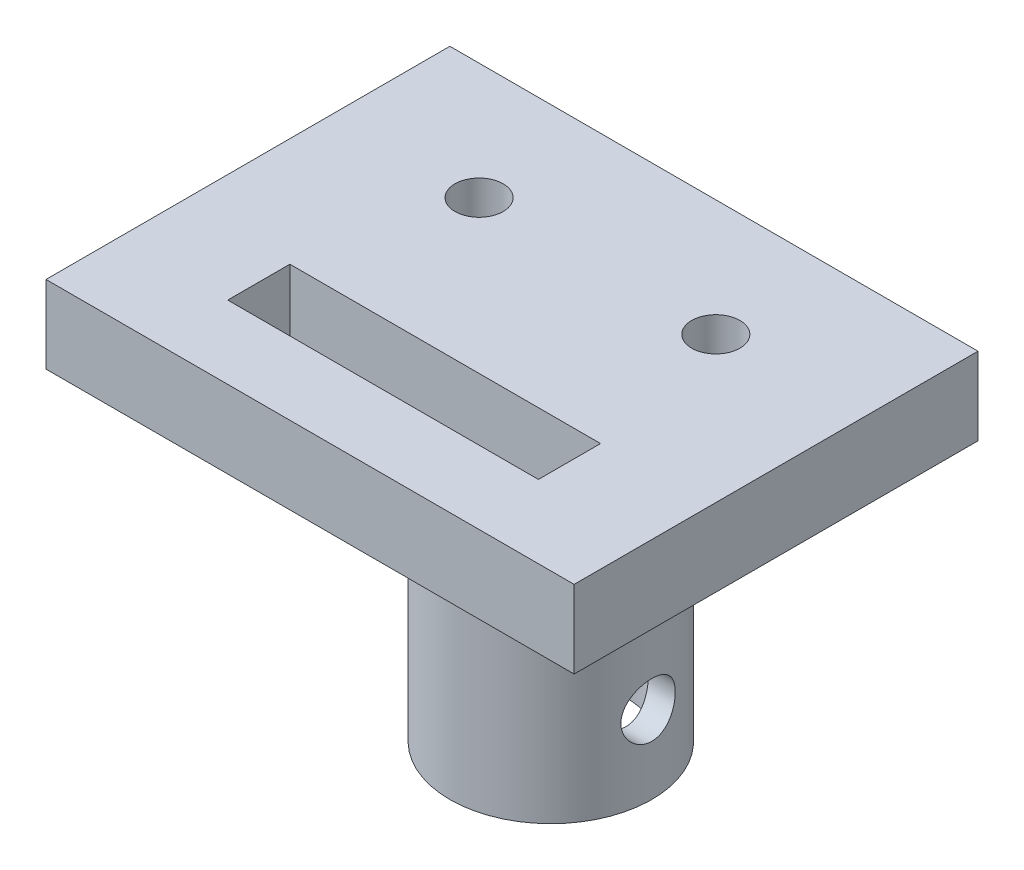
ISO-10303-21;
HEADER;
FILE_DESCRIPTION(('STEP AP214'),'2;1');
FILE_NAME('part.step','',(''),(''),'','','');
FILE_SCHEMA(('AUTOMOTIVE_DESIGN { 1 0 10303 214 1 1 1 1 }'));
ENDSEC;
DATA;
#1=APPLICATION_CONTEXT('core data for automotive mechanical design processes');
#2=APPLICATION_PROTOCOL_DEFINITION('international standard','automotive_design',2000,#1);
#3=PRODUCT_CONTEXT('',#1,'mechanical');
#4=PRODUCT('Part','Part','',(#3));
#5=PRODUCT_RELATED_PRODUCT_CATEGORY('part','',(#4));
#6=PRODUCT_DEFINITION_FORMATION('','',#4);
#7=PRODUCT_DEFINITION_CONTEXT('part definition',#1,'design');
#8=PRODUCT_DEFINITION('design','',#6,#7);
#9=PRODUCT_DEFINITION_SHAPE('','',#8);
#10=(LENGTH_UNIT() NAMED_UNIT(*) SI_UNIT(.MILLI.,.METRE.));
#11=(NAMED_UNIT(*) PLANE_ANGLE_UNIT() SI_UNIT($,.RADIAN.));
#12=(NAMED_UNIT(*) SI_UNIT($,.STERADIAN.) SOLID_ANGLE_UNIT());
#13=UNCERTAINTY_MEASURE_WITH_UNIT(LENGTH_MEASURE(1.E-05),#10,'distance_accuracy_value','');
#14=(GEOMETRIC_REPRESENTATION_CONTEXT(3) GLOBAL_UNCERTAINTY_ASSIGNED_CONTEXT((#13)) GLOBAL_UNIT_ASSIGNED_CONTEXT((#10,
#11,#12)) REPRESENTATION_CONTEXT('',''));
#15=CARTESIAN_POINT('',(0.,0.,0.));
#16=DIRECTION('',(0.,0.,1.));
#17=DIRECTION('',(1.,0.,0.));
#18=AXIS2_PLACEMENT_3D('',#15,#16,#17);
#19=CARTESIAN_POINT('',(0.,25.,0.));
#20=DIRECTION('',(0.,-1.,0.));
#21=DIRECTION('',(0.,0.,-1.));
#22=AXIS2_PLACEMENT_3D('',#19,#20,#21);
#23=CYLINDRICAL_SURFACE('',#22,6.5);
#24=CARTESIAN_POINT('',(-6.25999201277446,5.,-1.75));
#25=CARTESIAN_POINT('',(-6.25999364834224,5.09636693152251,-1.74999774759581));
#26=CARTESIAN_POINT('',(-6.26224156413629,5.19275754831568,-1.74201295319679));
#27=CARTESIAN_POINT('',(-6.27096280675779,5.38275250326044,-1.71034684680834));
#28=CARTESIAN_POINT('',(-6.27743820017108,5.47635545526069,-1.68665785779757));
#29=CARTESIAN_POINT('',(-6.2938290415138,5.65799901010124,-1.62442051083002));
#30=CARTESIAN_POINT('',(-6.30373958680569,5.7460473299389,-1.58589332124237));
#31=CARTESIAN_POINT('',(-6.32587778448479,5.91444505060657,-1.4951397936086));
#32=CARTESIAN_POINT('',(-6.3381056295633,5.99479381035502,-1.44291231619848));
#33=CARTESIAN_POINT('',(-6.36384999967837,6.14756006850606,-1.32481683575955));
#34=CARTESIAN_POINT('',(-6.3773897230645,6.21975220686104,-1.25866230723127));
#35=CARTESIAN_POINT('',(-6.40403218819677,6.35216265841744,-1.11520667104591));
#36=CARTESIAN_POINT('',(-6.41713488377715,6.41237970993447,-1.03790439035032));
#37=CARTESIAN_POINT('',(-6.44168618098059,6.5200732158384,-0.872781950497455));
#38=CARTESIAN_POINT('',(-6.45310422745752,6.56732520712722,-0.784810457726846));
#39=CARTESIAN_POINT('',(-6.47273330056194,6.64628270229484,-0.601812853080337));
#40=CARTESIAN_POINT('',(-6.48094487877107,6.67799088028443,-0.506787957891642));
#41=CARTESIAN_POINT('',(-6.49307175079196,6.72423010837478,-0.314733668615914));
#42=CARTESIAN_POINT('',(-6.49708279945289,6.73914461038798,-0.217802747330066));
#43=CARTESIAN_POINT('',(-6.50069164682133,6.75257997140598,-0.0227371580313452));
#44=CARTESIAN_POINT('',(-6.50029019790354,6.75110362521287,0.075397301915884));
#45=CARTESIAN_POINT('',(-6.49518926169102,6.73206830522229,0.267413777691123));
#46=CARTESIAN_POINT('',(-6.49060051383683,6.71492368507153,0.361340261807487));
#47=CARTESIAN_POINT('',(-6.47777153275455,6.66570843590665,0.544930372626499));
#48=CARTESIAN_POINT('',(-6.46953108931706,6.63363694762386,0.634593753595074));
#49=CARTESIAN_POINT('',(-6.45016118673602,6.55516353757223,0.808164857586516));
#50=CARTESIAN_POINT('',(-6.4390034608576,6.50862051045036,0.892005501146503));
#51=CARTESIAN_POINT('',(-6.41499985670216,6.40263373543751,1.05082715179685));
#52=CARTESIAN_POINT('',(-6.40215364408583,6.34318743103043,1.12580639863237));
#53=CARTESIAN_POINT('',(-6.3756898932816,6.21088557205601,1.26725020143798));
#54=CARTESIAN_POINT('',(-6.36206079715831,6.13766877046341,1.33337509587472));
#55=CARTESIAN_POINT('',(-6.3359290690376,5.98104466905633,1.45249162046951));
#56=CARTESIAN_POINT('',(-6.32342650852571,5.8976367233418,1.5054824175621));
#57=CARTESIAN_POINT('',(-6.30091637245831,5.72225009692862,1.59709184385151));
#58=CARTESIAN_POINT('',(-6.2909252527284,5.63022004826683,1.63561645775796));
#59=CARTESIAN_POINT('',(-6.27477285061401,5.44065286740862,1.69653467948176));
#60=CARTESIAN_POINT('',(-6.26861059736745,5.3431171381018,1.71893237673103));
#61=CARTESIAN_POINT('',(-6.26102094544429,5.14848803959217,1.74637186636212));
#62=CARTESIAN_POINT('',(-6.25945517547943,5.05147152071337,1.75192104365597));
#63=CARTESIAN_POINT('',(-6.26085688983675,4.85789646580634,1.74690530793352));
#64=CARTESIAN_POINT('',(-6.26382388109206,4.7613378811108,1.73634214759297));
#65=CARTESIAN_POINT('',(-6.27382299499931,4.57338610023024,1.69984924549858));
#66=CARTESIAN_POINT('',(-6.2807739509207,4.48192864140859,1.67422606891518));
#67=CARTESIAN_POINT('',(-6.2978781488742,4.30460992983483,1.60868595575755));
#68=CARTESIAN_POINT('',(-6.30803181501428,4.21874942005764,1.56876712603544));
#69=CARTESIAN_POINT('',(-6.3306802252249,4.05294338845818,1.4747437932278));
#70=CARTESIAN_POINT('',(-6.34322221754839,3.97317294112376,1.42034219945109));
#71=CARTESIAN_POINT('',(-6.36912368079378,3.82370694371339,1.29926471321738));
#72=CARTESIAN_POINT('',(-6.38248330813777,3.75401333006983,1.23258646717787));
#73=CARTESIAN_POINT('',(-6.40899229302136,3.62456493243245,1.08649869302637));
#74=CARTESIAN_POINT('',(-6.42212379122641,3.56516441907997,1.00677135328087));
#75=CARTESIAN_POINT('',(-6.4462926745243,3.46058906570298,0.83818329845797));
#76=CARTESIAN_POINT('',(-6.45733017110619,3.41541346822946,0.749323070023385));
#77=CARTESIAN_POINT('',(-6.47599626465671,3.34098780866232,0.565617208692505));
#78=CARTESIAN_POINT('',(-6.48365032258865,3.31161842448717,0.470822629812637));
#79=CARTESIAN_POINT('',(-6.49479925674954,3.26929493149581,0.277406294370145));
#80=CARTESIAN_POINT('',(-6.49829507386145,3.25633710920122,0.178785408800943));
#81=CARTESIAN_POINT('',(-6.50068826313714,3.24744093440552,-0.01617708383555));
#82=CARTESIAN_POINT('',(-6.49972592187705,3.25098338109258,-0.112493609735221));
#83=CARTESIAN_POINT('',(-6.49362915521792,3.2737790501558,-0.303106968695978));
#84=CARTESIAN_POINT('',(-6.48849489189772,3.2930316621934,-0.397403880072862));
#85=CARTESIAN_POINT('',(-6.47465995714558,3.34640532578378,-0.580663944124789));
#86=CARTESIAN_POINT('',(-6.46598501203548,3.38041923341873,-0.669660373083969));
#87=CARTESIAN_POINT('',(-6.44597493719409,3.46225440917336,-0.840733705885811));
#88=CARTESIAN_POINT('',(-6.43463942891539,3.51007764231986,-0.922809622810748));
#89=CARTESIAN_POINT('',(-6.41013655471924,3.61968338617937,-1.08012193055954));
#90=CARTESIAN_POINT('',(-6.39692789682886,3.68180882444473,-1.15511293807839));
#91=CARTESIAN_POINT('',(-6.37033174209729,3.81760750704241,-1.29378095877782));
#92=CARTESIAN_POINT('',(-6.35694419882193,3.89128380513143,-1.35745497050412));
#93=CARTESIAN_POINT('',(-6.33115802415569,4.05009028339241,-1.47310400417226));
#94=CARTESIAN_POINT('',(-6.31878848133984,4.13544118706903,-1.52478300921252));
#95=CARTESIAN_POINT('',(-6.2968530124979,4.31394271271354,-1.6129852621157));
#96=CARTESIAN_POINT('',(-6.2872852876391,4.40708828070918,-1.64951824037444));
#97=CARTESIAN_POINT('',(-6.2733380131077,4.58321606222728,-1.70171523556073));
#98=CARTESIAN_POINT('',(-6.26837422512567,4.66544849671204,-1.71977900317143));
#99=CARTESIAN_POINT('',(-6.26170070500979,4.83178142103546,-1.74392165433437));
#100=CARTESIAN_POINT('',(-6.25999058509381,4.91588168705138,-1.75000196611469));
#101=CARTESIAN_POINT('',(-6.25999201277446,5.,-1.75));
#102=B_SPLINE_CURVE_WITH_KNOTS('',3,(#24,#25,#26,#27,#28,#29,#30,#31,#32,#33,#34,#35,#36,#37,
#38,#39,#40,#41,#42,#43,#44,#45,#46,#47,#48,#49,#50,#51,#52,#53,#54,#55,#56,#57,#58,#59,#60,#61,
#62,#63,#64,#65,#66,#67,#68,#69,#70,#71,#72,#73,#74,#75,#76,#77,#78,#79,#80,#81,#82,#83,#84,#85,
#86,#87,#88,#89,#90,#91,#92,#93,#94,#95,#96,#97,#98,#99,#100,#101),.UNSPECIFIED.,.T.,.F.,(4,2,2,
2,2,2,2,2,2,2,2,2,2,2,2,2,2,2,2,2,2,2,2,2,2,2,2,2,2,2,2,2,2,2,2,2,2,2,4),(0.,0.288791410137463,
0.577724100637719,0.866246113798619,1.1547921290732,1.44998553324109,1.74521002226255,
2.04526257489719,2.34526348926331,2.63826599522772,2.93121854212772,3.21664121132964,
3.50208031298715,3.79039483129319,4.07876652535361,4.37615760001787,4.67356753268635,
4.97287817987484,5.27211290170058,5.56224219802969,5.85233993678286,6.13672745448546,
6.4211526470554,6.71193431253595,7.00277178252912,7.30219773917363,7.60160774927308,
7.89872460917345,8.19577422780333,8.48354110991476,8.77129681284008,9.0569979064276,
9.34273967450006,9.63621883592372,9.92977571709858,10.2299488059667,10.5299287520335,
10.7820436801477,11.0341285585496),.UNSPECIFIED.);
#103=CARTESIAN_POINT('',(-6.25999201277446,5.,-1.75));
#104=VERTEX_POINT('',#103);
#105=EDGE_CURVE('E137',#104,#104,#102,.T.);
#106=ORIENTED_EDGE('',*,*,#105,.T.);
#107=EDGE_LOOP('',(#106));
#108=FACE_BOUND('',#107,.T.);
#109=CARTESIAN_POINT('',(6.25999201277446,5.,-1.75));
#110=CARTESIAN_POINT('',(6.25999364834224,4.90363306847749,-1.74999774759582));
#111=CARTESIAN_POINT('',(6.26224156413629,4.80724245168432,-1.74201295319679));
#112=CARTESIAN_POINT('',(6.27096280675779,4.61724749673956,-1.71034684680835));
#113=CARTESIAN_POINT('',(6.27743820017108,4.52364454473932,-1.68665785779758));
#114=CARTESIAN_POINT('',(6.2938290415138,4.34200098989877,-1.62442051083002));
#115=CARTESIAN_POINT('',(6.30373958680569,4.2539526700611,-1.58589332124238));
#116=CARTESIAN_POINT('',(6.32587778448479,4.08555494939343,-1.4951397936086));
#117=CARTESIAN_POINT('',(6.3381056295633,4.00520618964498,-1.44291231619848));
#118=CARTESIAN_POINT('',(6.36384999967837,3.85243993149394,-1.32481683575956));
#119=CARTESIAN_POINT('',(6.3773897230645,3.78024779313896,-1.25866230723127));
#120=CARTESIAN_POINT('',(6.40403218819677,3.64783734158256,-1.11520667104591));
#121=CARTESIAN_POINT('',(6.41713488377715,3.58762029006553,-1.03790439035032));
#122=CARTESIAN_POINT('',(6.44168618098059,3.4799267841616,-0.872781950497458));
#123=CARTESIAN_POINT('',(6.45310422745752,3.43267479287278,-0.78481045772685));
#124=CARTESIAN_POINT('',(6.47273330056194,3.35371729770516,-0.60181285308034));
#125=CARTESIAN_POINT('',(6.48094487877107,3.32200911971557,-0.506787957891645));
#126=CARTESIAN_POINT('',(6.49307175079196,3.27576989162522,-0.314733668615916));
#127=CARTESIAN_POINT('',(6.49708279945289,3.26085538961202,-0.217802747330069));
#128=CARTESIAN_POINT('',(6.50069164682133,3.24742002859402,-0.0227371580313479));
#129=CARTESIAN_POINT('',(6.50029019790354,3.24889637478714,0.0753973019158814));
#130=CARTESIAN_POINT('',(6.49518926169102,3.26793169477771,0.267413777691121));
#131=CARTESIAN_POINT('',(6.49060051383683,3.28507631492847,0.361340261807485));
#132=CARTESIAN_POINT('',(6.47777153275455,3.33429156409335,0.544930372626496));
#133=CARTESIAN_POINT('',(6.46953108931706,3.36636305237614,0.634593753595071));
#134=CARTESIAN_POINT('',(6.45016118673602,3.44483646242777,0.808164857586513));
#135=CARTESIAN_POINT('',(6.4390034608576,3.49137948954965,0.892005501146501));
#136=CARTESIAN_POINT('',(6.41499985670216,3.59736626456249,1.05082715179685));
#137=CARTESIAN_POINT('',(6.40215364408583,3.65681256896957,1.12580639863236));
#138=CARTESIAN_POINT('',(6.3756898932816,3.78911442794399,1.26725020143797));
#139=CARTESIAN_POINT('',(6.36206079715831,3.86233122953659,1.33337509587472));
#140=CARTESIAN_POINT('',(6.3359290690376,4.01895533094367,1.4524916204695));
#141=CARTESIAN_POINT('',(6.32342650852571,4.1023632766582,1.5054824175621));
#142=CARTESIAN_POINT('',(6.30091637245831,4.27774990307138,1.59709184385151));
#143=CARTESIAN_POINT('',(6.2909252527284,4.36977995173317,1.63561645775796));
#144=CARTESIAN_POINT('',(6.27477285061402,4.55934713259138,1.69653467948176));
#145=CARTESIAN_POINT('',(6.26861059736745,4.65688286189821,1.71893237673102));
#146=CARTESIAN_POINT('',(6.26102094544429,4.85151196040783,1.74637186636212));
#147=CARTESIAN_POINT('',(6.25945517547943,4.94852847928663,1.75192104365597));
#148=CARTESIAN_POINT('',(6.26085688983675,5.14210353419366,1.74690530793352));
#149=CARTESIAN_POINT('',(6.26382388109206,5.2386621188892,1.73634214759296));
#150=CARTESIAN_POINT('',(6.27382299499932,5.42661389976976,1.69984924549857));
#151=CARTESIAN_POINT('',(6.2807739509207,5.51807135859141,1.67422606891518));
#152=CARTESIAN_POINT('',(6.2978781488742,5.69539007016517,1.60868595575755));
#153=CARTESIAN_POINT('',(6.30803181501428,5.78125057994236,1.56876712603544));
#154=CARTESIAN_POINT('',(6.3306802252249,5.94705661154182,1.47474379322779));
#155=CARTESIAN_POINT('',(6.3432222175484,6.02682705887624,1.42034219945109));
#156=CARTESIAN_POINT('',(6.36912368079379,6.17629305628661,1.29926471321737));
#157=CARTESIAN_POINT('',(6.38248330813777,6.24598666993017,1.23258646717786));
#158=CARTESIAN_POINT('',(6.40899229302136,6.37543506756755,1.08649869302637));
#159=CARTESIAN_POINT('',(6.42212379122641,6.43483558092003,1.00677135328087));
#160=CARTESIAN_POINT('',(6.4462926745243,6.53941093429702,0.838183298457966));
#161=CARTESIAN_POINT('',(6.45733017110619,6.58458653177054,0.749323070023381));
#162=CARTESIAN_POINT('',(6.47599626465671,6.65901219133768,0.565617208692501));
#163=CARTESIAN_POINT('',(6.48365032258865,6.68838157551284,0.470822629812632));
#164=CARTESIAN_POINT('',(6.49479925674954,6.73070506850419,0.277406294370141));
#165=CARTESIAN_POINT('',(6.49829507386145,6.74366289079878,0.178785408800939));
#166=CARTESIAN_POINT('',(6.50068826313714,6.75255906559448,-0.0161770838355532));
#167=CARTESIAN_POINT('',(6.49972592187705,6.74901661890742,-0.112493609735223));
#168=CARTESIAN_POINT('',(6.49362915521792,6.7262209498442,-0.30310696869598));
#169=CARTESIAN_POINT('',(6.48849489189772,6.7069683378066,-0.397403880072865));
#170=CARTESIAN_POINT('',(6.47465995714558,6.65359467421622,-0.580663944124793));
#171=CARTESIAN_POINT('',(6.46598501203548,6.61958076658127,-0.669660373083973));
#172=CARTESIAN_POINT('',(6.44597493719409,6.53774559082664,-0.840733705885815));
#173=CARTESIAN_POINT('',(6.43463942891539,6.48992235768014,-0.922809622810752));
#174=CARTESIAN_POINT('',(6.41013655471924,6.38031661382063,-1.08012193055955));
#175=CARTESIAN_POINT('',(6.39692789682886,6.31819117555527,-1.15511293807839));
#176=CARTESIAN_POINT('',(6.37033174209729,6.18239249295759,-1.29378095877782));
#177=CARTESIAN_POINT('',(6.35694419882193,6.10871619486857,-1.35745497050413));
#178=CARTESIAN_POINT('',(6.33115802415569,5.94990971660759,-1.47310400417226));
#179=CARTESIAN_POINT('',(6.31878848133984,5.86455881293097,-1.52478300921252));
#180=CARTESIAN_POINT('',(6.2968530124979,5.68605728728646,-1.61298526211571));
#181=CARTESIAN_POINT('',(6.2872852876391,5.59291171929082,-1.64951824037444));
#182=CARTESIAN_POINT('',(6.2733380131077,5.41678393777272,-1.70171523556074));
#183=CARTESIAN_POINT('',(6.26837422512567,5.33455150328796,-1.71977900317144));
#184=CARTESIAN_POINT('',(6.26170070500979,5.16821857896454,-1.74392165433437));
#185=CARTESIAN_POINT('',(6.25999058509381,5.08411831294862,-1.75000196611469));
#186=CARTESIAN_POINT('',(6.25999201277446,5.,-1.75));
#187=B_SPLINE_CURVE_WITH_KNOTS('',3,(#109,#110,#111,#112,#113,#114,#115,#116,#117,#118,#119,
#120,#121,#122,#123,#124,#125,#126,#127,#128,#129,#130,#131,#132,#133,#134,#135,#136,#137,#138,
#139,#140,#141,#142,#143,#144,#145,#146,#147,#148,#149,#150,#151,#152,#153,#154,#155,#156,#157,
#158,#159,#160,#161,#162,#163,#164,#165,#166,#167,#168,#169,#170,#171,#172,#173,#174,#175,#176,
#177,#178,#179,#180,#181,#182,#183,#184,#185,#186),.UNSPECIFIED.,.T.,.F.,(4,2,2,2,2,2,2,2,2,2,2,
2,2,2,2,2,2,2,2,2,2,2,2,2,2,2,2,2,2,2,2,2,2,2,2,2,2,2,4),(0.,0.288791410137463,
0.577724100637719,0.866246113798619,1.1547921290732,1.44998553324109,1.74521002226255,
2.04526257489719,2.34526348926331,2.63826599522772,2.93121854212772,3.21664121132964,
3.50208031298715,3.79039483129319,4.07876652535361,4.37615760001787,4.67356753268635,
4.97287817987484,5.27211290170058,5.5622421980297,5.85233993678286,6.13672745448546,
6.4211526470554,6.71193431253595,7.00277178252912,7.30219773917364,7.60160774927308,
7.89872460917345,8.19577422780333,8.48354110991476,8.77129681284008,9.0569979064276,
9.34273967450006,9.63621883592372,9.92977571709858,10.2299488059667,10.5299287520335,
10.7820436801477,11.0341285585496),.UNSPECIFIED.);
#188=CARTESIAN_POINT('',(6.25999201277446,5.,-1.75));
#189=VERTEX_POINT('',#188);
#190=EDGE_CURVE('E141',#189,#189,#187,.T.);
#191=ORIENTED_EDGE('',*,*,#190,.T.);
#192=EDGE_LOOP('',(#191));
#193=FACE_BOUND('',#192,.T.);
#194=CARTESIAN_POINT('',(0.,0.,0.));
#195=DIRECTION('',(0.,1.,0.));
#196=DIRECTION('',(0.,0.,1.));
#197=AXIS2_PLACEMENT_3D('',#194,#195,#196);
#198=CIRCLE('',#197,6.5);
#199=CARTESIAN_POINT('',(0.,0.,6.5));
#200=VERTEX_POINT('',#199);
#201=EDGE_CURVE('E54',#200,#200,#198,.T.);
#202=ORIENTED_EDGE('',*,*,#201,.T.);
#203=EDGE_LOOP('',(#202));
#204=FACE_BOUND('',#203,.T.);
#205=CARTESIAN_POINT('',(0.,20.,0.));
#206=DIRECTION('',(0.,1.,0.));
#207=DIRECTION('',(0.,0.,1.));
#208=AXIS2_PLACEMENT_3D('',#205,#206,#207);
#209=CIRCLE('',#208,6.5);
#210=CARTESIAN_POINT('',(0.,20.,6.5));
#211=VERTEX_POINT('',#210);
#212=EDGE_CURVE('E11',#211,#211,#209,.T.);
#213=ORIENTED_EDGE('',*,*,#212,.F.);
#214=EDGE_LOOP('',(#213));
#215=FACE_BOUND('',#214,.T.);
#216=ADVANCED_FACE('F39',(#108,#193,#204,#215),#23,.T.);
#217=CARTESIAN_POINT('',(0.,25.,0.));
#218=DIRECTION('',(0.,-1.,0.));
#219=DIRECTION('',(0.,0.,-1.));
#220=AXIS2_PLACEMENT_3D('',#217,#218,#219);
#221=CYLINDRICAL_SURFACE('',#220,4.85);
#222=CARTESIAN_POINT('',(-4.52327315115946,5.,-1.75));
#223=CARTESIAN_POINT('',(-4.52327107331991,5.09479626124007,-1.75000233787279));
#224=CARTESIAN_POINT('',(-4.52628562956524,5.18957648403884,-1.74227164301163));
#225=CARTESIAN_POINT('',(-4.53794143613434,5.37629655723689,-1.71168083222149));
#226=CARTESIAN_POINT('',(-4.54658286881508,5.46823631548065,-1.6888202259588));
#227=CARTESIAN_POINT('',(-4.56838886492763,5.64653257185704,-1.62890344347309));
#228=CARTESIAN_POINT('',(-4.58154329618446,5.73290106642419,-1.59187904526773));
#229=CARTESIAN_POINT('',(-4.61087736540607,5.8982327797882,-1.50479697568493));
#230=CARTESIAN_POINT('',(-4.62705783486314,5.97719395423147,-1.45473572056328));
#231=CARTESIAN_POINT('',(-4.66145416967343,6.12909782139075,-1.34053707758633));
#232=CARTESIAN_POINT('',(-4.67972681693185,6.20165146635098,-1.27589915977032));
#233=CARTESIAN_POINT('',(-4.71577282622121,6.33516022303496,-1.13544620193383));
#234=CARTESIAN_POINT('',(-4.73354609102642,6.39611308933621,-1.05962900310493));
#235=CARTESIAN_POINT('',(-4.76725950218397,6.50652535045012,-0.896054750251709));
#236=CARTESIAN_POINT('',(-4.7831252347627,6.5555672347442,-0.80799917413029));
#237=CARTESIAN_POINT('',(-4.81055822021807,6.63798286300634,-0.624215118043507));
#238=CARTESIAN_POINT('',(-4.82212684507945,6.67136160881436,-0.528489098992325));
#239=CARTESIAN_POINT('',(-4.83925940124697,6.72015501184759,-0.336167831105142));
#240=CARTESIAN_POINT('',(-4.84504615832443,6.73623828287937,-0.239762446030616));
#241=CARTESIAN_POINT('',(-4.85075957044147,6.75212074785862,-0.0454590058207521));
#242=CARTESIAN_POINT('',(-4.85068799052919,6.75192484652928,0.0524385908411838));
#243=CARTESIAN_POINT('',(-4.84483781874498,6.73565618143768,0.242176354555561));
#244=CARTESIAN_POINT('',(-4.83932108544856,6.72031189937554,0.334088430961246));
#245=CARTESIAN_POINT('',(-4.82353874644944,6.67540012165265,0.513932718896141));
#246=CARTESIAN_POINT('',(-4.81327280801824,6.64583162944039,0.601864651103188));
#247=CARTESIAN_POINT('',(-4.78883674033499,6.57294265468195,0.772723975038846));
#248=CARTESIAN_POINT('',(-4.77461345153803,6.52943360640793,0.855563007280901));
#249=CARTESIAN_POINT('',(-4.74371669129372,6.43006106416222,1.01296349736891));
#250=CARTESIAN_POINT('',(-4.72704246431206,6.37419375790208,1.08752239026515));
#251=CARTESIAN_POINT('',(-4.69190299930545,6.24812266206237,1.23055484076657));
#252=CARTESIAN_POINT('',(-4.67338967898639,6.17730311488823,1.29847466983834));
#253=CARTESIAN_POINT('',(-4.63739975811484,6.02515004879938,1.42167239652171));
#254=CARTESIAN_POINT('',(-4.61992338021606,5.94381428366141,1.47694758628221));
#255=CARTESIAN_POINT('',(-4.5876965663473,5.77090642328478,1.57423845485121));
#256=CARTESIAN_POINT('',(-4.57300493868097,5.67916771607576,1.6159790488563));
#257=CARTESIAN_POINT('',(-4.54868930398322,5.48929532757414,1.68321693307391));
#258=CARTESIAN_POINT('',(-4.53906272747525,5.3911649172117,1.70872246063934));
#259=CARTESIAN_POINT('',(-4.52656443481111,5.19673175753582,1.74155358533104));
#260=CARTESIAN_POINT('',(-4.52336891767821,5.10059725148658,1.74975173575979));
#261=CARTESIAN_POINT('',(-4.52318175372119,4.90829394971302,1.75023697117237));
#262=CARTESIAN_POINT('',(-4.52618871608319,4.81212516650954,1.74252762317631));
#263=CARTESIAN_POINT('',(-4.53774088485327,4.62677378932292,1.71220560999024));
#264=CARTESIAN_POINT('',(-4.54604443312444,4.53746816383273,1.69024254721493));
#265=CARTESIAN_POINT('',(-4.56697480713838,4.36384185838638,1.6328404090695));
#266=CARTESIAN_POINT('',(-4.5796024781498,4.27952215684806,1.59739869877725));
#267=CARTESIAN_POINT('',(-4.60831251006726,4.11492792230955,1.51262060176581));
#268=CARTESIAN_POINT('',(-4.62450183399319,4.03490418156202,1.4628345715628));
#269=CARTESIAN_POINT('',(-4.65832180899458,3.88403484044375,1.35127011904792));
#270=CARTESIAN_POINT('',(-4.67595295162089,3.81319239165263,1.28948759689256));
#271=CARTESIAN_POINT('',(-4.71190397331729,3.6784472557155,1.15144611039997));
#272=CARTESIAN_POINT('',(-4.73020463049639,3.61518379436703,1.07455611876808));
#273=CARTESIAN_POINT('',(-4.76444446706944,3.50239335574286,0.910799898314313));
#274=CARTESIAN_POINT('',(-4.78038367725442,3.45286619935147,0.823933799597618));
#275=CARTESIAN_POINT('',(-4.80806723596673,3.36933725265586,0.642902719905017));
#276=CARTESIAN_POINT('',(-4.81983145195657,3.33526171170272,0.548774974969922));
#277=CARTESIAN_POINT('',(-4.83791638685997,3.28360041635232,0.355606968438008));
#278=CARTESIAN_POINT('',(-4.84423945138128,3.26600755620088,0.25656884313379));
#279=CARTESIAN_POINT('',(-4.85052306430374,3.24853395944242,0.062191949996831));
#280=CARTESIAN_POINT('',(-4.85081091007602,3.24774205672966,-0.0330551121390795));
#281=CARTESIAN_POINT('',(-4.84582831152712,3.26158290916963,-0.222263917289975));
#282=CARTESIAN_POINT('',(-4.84055845586836,3.27621403074141,-0.316225795361802));
#283=CARTESIAN_POINT('',(-4.82519243091806,3.31985579328208,-0.498183905109834));
#284=CARTESIAN_POINT('',(-4.81520106939202,3.34855465192371,-0.586264425861093));
#285=CARTESIAN_POINT('',(-4.79142747153947,3.41921517042377,-0.756377775328888));
#286=CARTESIAN_POINT('',(-4.77764452267554,3.46117932339563,-0.838409463635298));
#287=CARTESIAN_POINT('',(-4.74698721362032,3.55912055463674,-0.997728060581551));
#288=CARTESIAN_POINT('',(-4.73001028970782,3.61559615832734,-1.07468843164296));
#289=CARTESIAN_POINT('',(-4.69506675010969,3.74015022229348,-1.2183276608389));
#290=CARTESIAN_POINT('',(-4.67709979434079,3.80823268664016,-1.28500295571355));
#291=CARTESIAN_POINT('',(-4.64115686413581,3.95795492829007,-1.40945480102558));
#292=CARTESIAN_POINT('',(-4.62322171899268,4.0400880467259,-1.4666517843949));
#293=CARTESIAN_POINT('',(-4.59037760579776,4.21336893382359,-1.56643039078522));
#294=CARTESIAN_POINT('',(-4.57546853445991,4.30451639464963,-1.60901251267547));
#295=CARTESIAN_POINT('',(-4.55044278495098,4.49454305953776,-1.67850069979328));
#296=CARTESIAN_POINT('',(-4.54038642382609,4.5935026295386,-1.70521037614622));
#297=CARTESIAN_POINT('',(-4.52680446508506,4.79498233077754,-1.74095406694497));
#298=CARTESIAN_POINT('',(-4.52327539784542,4.8975005408554,-1.74999747215034));
#299=CARTESIAN_POINT('',(-4.52327315115946,5.,-1.75));
#300=B_SPLINE_CURVE_WITH_KNOTS('',3,(#222,#223,#224,#225,#226,#227,#228,#229,#230,#231,#232,
#233,#234,#235,#236,#237,#238,#239,#240,#241,#242,#243,#244,#245,#246,#247,#248,#249,#250,#251,
#252,#253,#254,#255,#256,#257,#258,#259,#260,#261,#262,#263,#264,#265,#266,#267,#268,#269,#270,
#271,#272,#273,#274,#275,#276,#277,#278,#279,#280,#281,#282,#283,#284,#285,#286,#287,#288,#289,
#290,#291,#292,#293,#294,#295,#296,#297,#298,#299),.UNSPECIFIED.,.T.,.F.,(4,2,2,2,2,2,2,2,2,2,2,
2,2,2,2,2,2,2,2,2,2,2,2,2,2,2,2,2,2,2,2,2,2,2,2,2,2,2,4),(0.,0.284007837079233,
0.568024878801577,0.851408399369099,1.13486990254091,1.43016911217536,1.72552542130887,
2.03008874178002,2.33455473722121,2.62677325234133,2.91890372577858,3.19763789002221,
3.47639158529171,3.75908738651913,4.0418705159601,4.3400776436138,4.6383485727031,
4.94234873802108,5.24619453643631,5.53431538996855,5.82237164370233,6.09814317827274,
6.37396865077269,6.65961133698769,6.9453518149626,7.24763516958804,7.54991458237896,
7.85073562193872,8.15142691650757,8.43576650125623,8.72007597225736,8.99835124579315,
9.27667885022352,9.56627436065588,9.85596997706728,10.1595483947041,10.4631164488491,
10.7703662912477,11.0774527661006),.UNSPECIFIED.);
#301=CARTESIAN_POINT('',(-4.52327315115946,5.,-1.75));
#302=VERTEX_POINT('',#301);
#303=EDGE_CURVE('E43',#302,#302,#300,.T.);
#304=ORIENTED_EDGE('',*,*,#303,.F.);
#305=EDGE_LOOP('',(#304));
#306=FACE_BOUND('',#305,.T.);
#307=CARTESIAN_POINT('',(4.52327315115946,5.,-1.75));
#308=CARTESIAN_POINT('',(4.52327107331991,4.90520373875993,-1.75000233787279));
#309=CARTESIAN_POINT('',(4.52628562956524,4.81042351596116,-1.74227164301163));
#310=CARTESIAN_POINT('',(4.53794143613434,4.62370344276311,-1.71168083222149));
#311=CARTESIAN_POINT('',(4.54658286881508,4.53176368451935,-1.6888202259588));
#312=CARTESIAN_POINT('',(4.56838886492763,4.35346742814296,-1.6289034434731));
#313=CARTESIAN_POINT('',(4.58154329618445,4.26709893357581,-1.59187904526773));
#314=CARTESIAN_POINT('',(4.61087736540607,4.1017672202118,-1.50479697568493));
#315=CARTESIAN_POINT('',(4.62705783486314,4.02280604576853,-1.45473572056328));
#316=CARTESIAN_POINT('',(4.66145416967344,3.87090217860925,-1.34053707758633));
#317=CARTESIAN_POINT('',(4.67972681693184,3.79834853364902,-1.27589915977032));
#318=CARTESIAN_POINT('',(4.7157728262212,3.66483977696504,-1.13544620193384));
#319=CARTESIAN_POINT('',(4.73354609102642,3.60388691066379,-1.05962900310494));
#320=CARTESIAN_POINT('',(4.76725950218397,3.49347464954988,-0.896054750251711));
#321=CARTESIAN_POINT('',(4.7831252347627,3.4444327652558,-0.807999174130292));
#322=CARTESIAN_POINT('',(4.81055822021807,3.36201713699366,-0.624215118043509));
#323=CARTESIAN_POINT('',(4.82212684507945,3.32863839118564,-0.528489098992327));
#324=CARTESIAN_POINT('',(4.83925940124697,3.27984498815241,-0.336167831105144));
#325=CARTESIAN_POINT('',(4.84504615832443,3.26376171712063,-0.239762446030618));
#326=CARTESIAN_POINT('',(4.85075957044147,3.24787925214138,-0.0454590058207545));
#327=CARTESIAN_POINT('',(4.85068799052919,3.24807515347072,0.0524385908411813));
#328=CARTESIAN_POINT('',(4.84483781874498,3.26434381856232,0.242176354555559));
#329=CARTESIAN_POINT('',(4.83932108544856,3.27968810062446,0.334088430961243));
#330=CARTESIAN_POINT('',(4.82353874644944,3.32459987834735,0.513932718896139));
#331=CARTESIAN_POINT('',(4.81327280801824,3.35416837055961,0.601864651103186));
#332=CARTESIAN_POINT('',(4.78883674033499,3.42705734531805,0.772723975038844));
#333=CARTESIAN_POINT('',(4.77461345153803,3.47056639359207,0.855563007280899));
#334=CARTESIAN_POINT('',(4.74371669129372,3.56993893583778,1.0129634973689));
#335=CARTESIAN_POINT('',(4.72704246431206,3.62580624209792,1.08752239026514));
#336=CARTESIAN_POINT('',(4.69190299930545,3.75187733793763,1.23055484076657));
#337=CARTESIAN_POINT('',(4.6733896789864,3.82269688511177,1.29847466983833));
#338=CARTESIAN_POINT('',(4.63739975811485,3.97484995120062,1.42167239652171));
#339=CARTESIAN_POINT('',(4.61992338021606,4.05618571633858,1.47694758628221));
#340=CARTESIAN_POINT('',(4.5876965663473,4.22909357671522,1.57423845485121));
#341=CARTESIAN_POINT('',(4.57300493868097,4.32083228392424,1.6159790488563));
#342=CARTESIAN_POINT('',(4.54868930398322,4.51070467242586,1.6832169330739));
#343=CARTESIAN_POINT('',(4.53906272747525,4.6088350827883,1.70872246063934));
#344=CARTESIAN_POINT('',(4.52656443481111,4.80326824246418,1.74155358533104));
#345=CARTESIAN_POINT('',(4.52336891767821,4.89940274851342,1.74975173575979));
#346=CARTESIAN_POINT('',(4.52318175372119,5.09170605028698,1.75023697117237));
#347=CARTESIAN_POINT('',(4.52618871608319,5.18787483349046,1.74252762317631));
#348=CARTESIAN_POINT('',(4.53774088485328,5.37322621067708,1.71220560999023));
#349=CARTESIAN_POINT('',(4.54604443312444,5.46253183616727,1.69024254721493));
#350=CARTESIAN_POINT('',(4.56697480713838,5.63615814161362,1.6328404090695));
#351=CARTESIAN_POINT('',(4.5796024781498,5.72047784315194,1.59739869877725));
#352=CARTESIAN_POINT('',(4.60831251006726,5.88507207769045,1.51262060176581));
#353=CARTESIAN_POINT('',(4.62450183399319,5.96509581843798,1.4628345715628));
#354=CARTESIAN_POINT('',(4.65832180899458,6.11596515955625,1.35127011904792));
#355=CARTESIAN_POINT('',(4.67595295162089,6.18680760834738,1.28948759689255));
#356=CARTESIAN_POINT('',(4.71190397331729,6.3215527442845,1.15144611039997));
#357=CARTESIAN_POINT('',(4.73020463049639,6.38481620563297,1.07455611876807));
#358=CARTESIAN_POINT('',(4.76444446706944,6.49760664425714,0.910799898314311));
#359=CARTESIAN_POINT('',(4.78038367725442,6.54713380064853,0.823933799597616));
#360=CARTESIAN_POINT('',(4.80806723596673,6.63066274734414,0.642902719905016));
#361=CARTESIAN_POINT('',(4.81983145195657,6.66473828829728,0.54877497496992));
#362=CARTESIAN_POINT('',(4.83791638685997,6.71639958364768,0.355606968438006));
#363=CARTESIAN_POINT('',(4.84423945138128,6.73399244379912,0.256568843133789));
#364=CARTESIAN_POINT('',(4.85052306430374,6.75146604055759,0.0621919499968297));
#365=CARTESIAN_POINT('',(4.85081091007602,6.75225794327034,-0.0330551121390808));
#366=CARTESIAN_POINT('',(4.84582831152712,6.73841709083037,-0.222263917289977));
#367=CARTESIAN_POINT('',(4.84055845586836,6.72378596925859,-0.316225795361804));
#368=CARTESIAN_POINT('',(4.82519243091806,6.68014420671792,-0.498183905109836));
#369=CARTESIAN_POINT('',(4.81520106939202,6.65144534807629,-0.586264425861094));
#370=CARTESIAN_POINT('',(4.79142747153947,6.58078482957623,-0.756377775328889));
#371=CARTESIAN_POINT('',(4.77764452267554,6.53882067660437,-0.838409463635299));
#372=CARTESIAN_POINT('',(4.74698721362032,6.44087944536326,-0.997728060581553));
#373=CARTESIAN_POINT('',(4.73001028970782,6.38440384167266,-1.07468843164296));
#374=CARTESIAN_POINT('',(4.69506675010969,6.25984977770652,-1.2183276608389));
#375=CARTESIAN_POINT('',(4.67709979434079,6.19176731335985,-1.28500295571355));
#376=CARTESIAN_POINT('',(4.64115686413581,6.04204507170993,-1.40945480102558));
#377=CARTESIAN_POINT('',(4.62322171899268,5.9599119532741,-1.4666517843949));
#378=CARTESIAN_POINT('',(4.59037760579776,5.78663106617642,-1.56643039078523));
#379=CARTESIAN_POINT('',(4.57546853445991,5.69548360535038,-1.60901251267547));
#380=CARTESIAN_POINT('',(4.55044278495097,5.50545694046224,-1.67850069979329));
#381=CARTESIAN_POINT('',(4.54038642382609,5.4064973704614,-1.70521037614622));
#382=CARTESIAN_POINT('',(4.52680446508506,5.20501766922246,-1.74095406694497));
#383=CARTESIAN_POINT('',(4.52327539784542,5.1024994591446,-1.74999747215034));
#384=CARTESIAN_POINT('',(4.52327315115946,5.,-1.75));
#385=B_SPLINE_CURVE_WITH_KNOTS('',3,(#307,#308,#309,#310,#311,#312,#313,#314,#315,#316,#317,
#318,#319,#320,#321,#322,#323,#324,#325,#326,#327,#328,#329,#330,#331,#332,#333,#334,#335,#336,
#337,#338,#339,#340,#341,#342,#343,#344,#345,#346,#347,#348,#349,#350,#351,#352,#353,#354,#355,
#356,#357,#358,#359,#360,#361,#362,#363,#364,#365,#366,#367,#368,#369,#370,#371,#372,#373,#374,
#375,#376,#377,#378,#379,#380,#381,#382,#383,#384),.UNSPECIFIED.,.T.,.F.,(4,2,2,2,2,2,2,2,2,2,2,
2,2,2,2,2,2,2,2,2,2,2,2,2,2,2,2,2,2,2,2,2,2,2,2,2,2,2,4),(0.,0.284007837079233,
0.568024878801577,0.851408399369101,1.13486990254091,1.43016911217536,1.72552542130887,
2.03008874178002,2.33455473722121,2.62677325234132,2.91890372577858,3.19763789002221,
3.4763915852917,3.75908738651913,4.0418705159601,4.34007764361379,4.6383485727031,
4.94234873802108,5.24619453643631,5.53431538996855,5.82237164370232,6.09814317827274,
6.37396865077269,6.65961133698769,6.9453518149626,7.24763516958804,7.54991458237896,
7.85073562193872,8.15142691650757,8.43576650125623,8.72007597225736,8.99835124579315,
9.27667885022352,9.56627436065588,9.85596997706728,10.1595483947041,10.4631164488491,
10.7703662912477,11.0774527661006),.UNSPECIFIED.);
#386=CARTESIAN_POINT('',(4.52327315115946,5.,-1.75));
#387=VERTEX_POINT('',#386);
#388=EDGE_CURVE('E233',#387,#387,#385,.T.);
#389=ORIENTED_EDGE('',*,*,#388,.F.);
#390=EDGE_LOOP('',(#389));
#391=FACE_BOUND('',#390,.T.);
#392=CARTESIAN_POINT('',(0.,0.,0.));
#393=DIRECTION('',(0.,1.,0.));
#394=DIRECTION('',(0.,0.,1.));
#395=AXIS2_PLACEMENT_3D('',#392,#393,#394);
#396=CIRCLE('',#395,4.85);
#397=CARTESIAN_POINT('',(0.,0.,4.85));
#398=VERTEX_POINT('',#397);
#399=EDGE_CURVE('E224',#398,#398,#396,.T.);
#400=ORIENTED_EDGE('',*,*,#399,.F.);
#401=EDGE_LOOP('',(#400));
#402=FACE_BOUND('',#401,.T.);
#403=CARTESIAN_POINT('',(0.,20.,0.));
#404=DIRECTION('',(0.,1.,0.));
#405=DIRECTION('',(0.,0.,1.));
#406=AXIS2_PLACEMENT_3D('',#403,#404,#405);
#407=CIRCLE('',#406,4.85);
#408=CARTESIAN_POINT('',(0.,20.,4.85));
#409=VERTEX_POINT('',#408);
#410=EDGE_CURVE('E215',#409,#409,#407,.T.);
#411=ORIENTED_EDGE('',*,*,#410,.T.);
#412=EDGE_LOOP('',(#411));
#413=FACE_BOUND('',#412,.T.);
#414=ADVANCED_FACE('F239',(#306,#391,#402,#413),#221,.F.);
#415=CARTESIAN_POINT('',(0.,0.,0.));
#416=DIRECTION('',(0.,1.,0.));
#417=DIRECTION('',(0.,0.,1.));
#418=AXIS2_PLACEMENT_3D('',#415,#416,#417);
#419=PLANE('',#418);
#420=ORIENTED_EDGE('',*,*,#201,.F.);
#421=EDGE_LOOP('',(#420));
#422=FACE_BOUND('',#421,.T.);
#423=ORIENTED_EDGE('',*,*,#399,.T.);
#424=EDGE_LOOP('',(#423));
#425=FACE_BOUND('',#424,.T.);
#426=ADVANCED_FACE('F272',(#422,#425),#419,.F.);
#427=CARTESIAN_POINT('',(0.,20.,0.));
#428=DIRECTION('',(0.,1.,0.));
#429=DIRECTION('',(0.,0.,1.));
#430=AXIS2_PLACEMENT_3D('',#427,#428,#429);
#431=PLANE('',#430);
#432=ORIENTED_EDGE('',*,*,#410,.F.);
#433=EDGE_LOOP('',(#432));
#434=FACE_BOUND('',#433,.T.);
#435=ADVANCED_FACE('F279',(#434),#431,.F.);
#436=CARTESIAN_POINT('',(17.,20.,-10.5));
#437=DIRECTION('',(1.,0.,0.));
#438=DIRECTION('',(0.,0.,-1.));
#439=AXIS2_PLACEMENT_3D('',#436,#437,#438);
#440=PLANE('',#439);
#441=DIRECTION('',(0.,0.,-1.));
#442=VECTOR('',#441,1.);
#443=CARTESIAN_POINT('',(17.,25.,-10.5));
#444=LINE('',#443,#442);
#445=CARTESIAN_POINT('',(17.,25.,15.5));
#446=VERTEX_POINT('',#445);
#447=CARTESIAN_POINT('',(17.,25.,-10.5));
#448=VERTEX_POINT('',#447);
#449=EDGE_CURVE('E179',#446,#448,#444,.T.);
#450=ORIENTED_EDGE('',*,*,#449,.F.);
#451=DIRECTION('',(0.,1.,0.));
#452=VECTOR('',#451,1.);
#453=CARTESIAN_POINT('',(17.,20.,15.5));
#454=LINE('',#453,#452);
#455=CARTESIAN_POINT('',(17.,20.,15.5));
#456=VERTEX_POINT('',#455);
#457=EDGE_CURVE('E212',#456,#446,#454,.T.);
#458=ORIENTED_EDGE('',*,*,#457,.F.);
#459=DIRECTION('',(0.,0.,-1.));
#460=VECTOR('',#459,1.);
#461=CARTESIAN_POINT('',(17.,20.,-10.5));
#462=LINE('',#461,#460);
#463=CARTESIAN_POINT('',(17.,20.,-10.5));
#464=VERTEX_POINT('',#463);
#465=EDGE_CURVE('E180',#456,#464,#462,.T.);
#466=ORIENTED_EDGE('',*,*,#465,.T.);
#467=DIRECTION('',(0.,1.,0.));
#468=VECTOR('',#467,1.);
#469=CARTESIAN_POINT('',(17.,20.,-10.5));
#470=LINE('',#469,#468);
#471=EDGE_CURVE('E197',#464,#448,#470,.T.);
#472=ORIENTED_EDGE('',*,*,#471,.T.);
#473=EDGE_LOOP('',(#450,#458,#466,#472));
#474=FACE_BOUND('',#473,.T.);
#475=ADVANCED_FACE('F281',(#474),#440,.T.);
#476=CARTESIAN_POINT('',(-17.,20.,15.5));
#477=DIRECTION('',(0.,0.,1.));
#478=DIRECTION('',(1.,0.,0.));
#479=AXIS2_PLACEMENT_3D('',#476,#477,#478);
#480=PLANE('',#479);
#481=DIRECTION('',(1.,0.,0.));
#482=VECTOR('',#481,1.);
#483=CARTESIAN_POINT('',(-17.,25.,15.5));
#484=LINE('',#483,#482);
#485=CARTESIAN_POINT('',(-17.,25.,15.5));
#486=VERTEX_POINT('',#485);
#487=EDGE_CURVE('E185',#486,#446,#484,.T.);
#488=ORIENTED_EDGE('',*,*,#487,.F.);
#489=DIRECTION('',(0.,1.,0.));
#490=VECTOR('',#489,1.);
#491=CARTESIAN_POINT('',(-17.,20.,15.5));
#492=LINE('',#491,#490);
#493=CARTESIAN_POINT('',(-17.,20.,15.5));
#494=VERTEX_POINT('',#493);
#495=EDGE_CURVE('E216',#494,#486,#492,.T.);
#496=ORIENTED_EDGE('',*,*,#495,.F.);
#497=DIRECTION('',(1.,0.,0.));
#498=VECTOR('',#497,1.);
#499=CARTESIAN_POINT('',(-17.,20.,15.5));
#500=LINE('',#499,#498);
#501=EDGE_CURVE('E193',#494,#456,#500,.T.);
#502=ORIENTED_EDGE('',*,*,#501,.T.);
#503=ORIENTED_EDGE('',*,*,#457,.T.);
#504=EDGE_LOOP('',(#488,#496,#502,#503));
#505=FACE_BOUND('',#504,.T.);
#506=ADVANCED_FACE('F288',(#505),#480,.T.);
#507=CARTESIAN_POINT('',(-17.,20.,-10.5));
#508=DIRECTION('',(-1.,0.,0.));
#509=DIRECTION('',(0.,0.,1.));
#510=AXIS2_PLACEMENT_3D('',#507,#508,#509);
#511=PLANE('',#510);
#512=DIRECTION('',(0.,0.,1.));
#513=VECTOR('',#512,1.);
#514=CARTESIAN_POINT('',(-17.,25.,-10.5));
#515=LINE('',#514,#513);
#516=CARTESIAN_POINT('',(-17.,25.,-10.5));
#517=VERTEX_POINT('',#516);
#518=EDGE_CURVE('E205',#517,#486,#515,.T.);
#519=ORIENTED_EDGE('',*,*,#518,.F.);
#520=DIRECTION('',(0.,1.,0.));
#521=VECTOR('',#520,1.);
#522=CARTESIAN_POINT('',(-17.,20.,-10.5));
#523=LINE('',#522,#521);
#524=CARTESIAN_POINT('',(-17.,20.,-10.5));
#525=VERTEX_POINT('',#524);
#526=EDGE_CURVE('E219',#525,#517,#523,.T.);
#527=ORIENTED_EDGE('',*,*,#526,.F.);
#528=DIRECTION('',(0.,0.,1.));
#529=VECTOR('',#528,1.);
#530=CARTESIAN_POINT('',(-17.,20.,-10.5));
#531=LINE('',#530,#529);
#532=EDGE_CURVE('E189',#525,#494,#531,.T.);
#533=ORIENTED_EDGE('',*,*,#532,.T.);
#534=ORIENTED_EDGE('',*,*,#495,.T.);
#535=EDGE_LOOP('',(#519,#527,#533,#534));
#536=FACE_BOUND('',#535,.T.);
#537=ADVANCED_FACE('F316',(#536),#511,.T.);
#538=CARTESIAN_POINT('',(-17.,20.,-10.5));
#539=DIRECTION('',(0.,0.,-1.));
#540=DIRECTION('',(-1.,0.,0.));
#541=AXIS2_PLACEMENT_3D('',#538,#539,#540);
#542=PLANE('',#541);
#543=DIRECTION('',(-1.,0.,0.));
#544=VECTOR('',#543,1.);
#545=CARTESIAN_POINT('',(-17.,25.,-10.5));
#546=LINE('',#545,#544);
#547=EDGE_CURVE('E201',#448,#517,#546,.T.);
#548=ORIENTED_EDGE('',*,*,#547,.F.);
#549=ORIENTED_EDGE('',*,*,#471,.F.);
#550=DIRECTION('',(-1.,0.,0.));
#551=VECTOR('',#550,1.);
#552=CARTESIAN_POINT('',(-17.,20.,-10.5));
#553=LINE('',#552,#551);
#554=EDGE_CURVE('E184',#464,#525,#553,.T.);
#555=ORIENTED_EDGE('',*,*,#554,.T.);
#556=ORIENTED_EDGE('',*,*,#526,.T.);
#557=EDGE_LOOP('',(#548,#549,#555,#556));
#558=FACE_BOUND('',#557,.T.);
#559=ADVANCED_FACE('F294',(#558),#542,.T.);
#560=DIRECTION('',(0.,0.,-1.));
#561=VECTOR('',#560,1.);
#562=CARTESIAN_POINT('',(-10.,20.,0.));
#563=LINE('',#562,#561);
#564=CARTESIAN_POINT('',(-10.,20.,10.8));
#565=VERTEX_POINT('',#564);
#566=CARTESIAN_POINT('',(-10.,20.,6.8));
#567=VERTEX_POINT('',#566);
#568=EDGE_CURVE('E115',#565,#567,#563,.T.);
#569=ORIENTED_EDGE('',*,*,#568,.F.);
#570=DIRECTION('',(-1.,0.,0.));
#571=VECTOR('',#570,1.);
#572=CARTESIAN_POINT('',(0.,20.,10.8));
#573=LINE('',#572,#571);
#574=CARTESIAN_POINT('',(10.,20.,10.8));
#575=VERTEX_POINT('',#574);
#576=EDGE_CURVE('E168',#575,#565,#573,.T.);
#577=ORIENTED_EDGE('',*,*,#576,.F.);
#578=DIRECTION('',(0.,0.,1.));
#579=VECTOR('',#578,1.);
#580=CARTESIAN_POINT('',(10.,20.,0.));
#581=LINE('',#580,#579);
#582=CARTESIAN_POINT('',(10.,20.,6.8));
#583=VERTEX_POINT('',#582);
#584=EDGE_CURVE('E171',#583,#575,#581,.T.);
#585=ORIENTED_EDGE('',*,*,#584,.F.);
#586=DIRECTION('',(1.,0.,0.));
#587=VECTOR('',#586,1.);
#588=CARTESIAN_POINT('',(0.,20.,6.8));
#589=LINE('',#588,#587);
#590=EDGE_CURVE('E174',#567,#583,#589,.T.);
#591=ORIENTED_EDGE('',*,*,#590,.F.);
#592=EDGE_LOOP('',(#569,#577,#585,#591));
#593=FACE_BOUND('',#592,.T.);
#594=CARTESIAN_POINT('',(-7.62,20.,-3.));
#595=DIRECTION('',(0.,1.,0.));
#596=DIRECTION('',(0.,0.,1.));
#597=AXIS2_PLACEMENT_3D('',#594,#595,#596);
#598=CIRCLE('',#597,1.55);
#599=CARTESIAN_POINT('',(-7.62,20.,-1.45));
#600=VERTEX_POINT('',#599);
#601=EDGE_CURVE('E164',#600,#600,#598,.F.);
#602=ORIENTED_EDGE('',*,*,#601,.F.);
#603=EDGE_LOOP('',(#602));
#604=FACE_BOUND('',#603,.T.);
#605=CARTESIAN_POINT('',(7.62,20.,-3.));
#606=DIRECTION('',(0.,1.,0.));
#607=DIRECTION('',(0.,0.,1.));
#608=AXIS2_PLACEMENT_3D('',#605,#606,#607);
#609=CIRCLE('',#608,1.55);
#610=CARTESIAN_POINT('',(7.62,20.,-1.45));
#611=VERTEX_POINT('',#610);
#612=EDGE_CURVE('E160',#611,#611,#609,.F.);
#613=ORIENTED_EDGE('',*,*,#612,.F.);
#614=EDGE_LOOP('',(#613));
#615=FACE_BOUND('',#614,.T.);
#616=ORIENTED_EDGE('',*,*,#212,.T.);
#617=EDGE_LOOP('',(#616));
#618=FACE_BOUND('',#617,.T.);
#619=ORIENTED_EDGE('',*,*,#465,.F.);
#620=ORIENTED_EDGE('',*,*,#501,.F.);
#621=ORIENTED_EDGE('',*,*,#532,.F.);
#622=ORIENTED_EDGE('',*,*,#554,.F.);
#623=EDGE_LOOP('',(#619,#620,#621,#622));
#624=FACE_BOUND('',#623,.T.);
#625=ADVANCED_FACE('F283',(#593,#604,#615,#618,#624),#431,.F.);
#626=CARTESIAN_POINT('',(0.,25.,0.));
#627=DIRECTION('',(0.,1.,0.));
#628=DIRECTION('',(0.,0.,1.));
#629=AXIS2_PLACEMENT_3D('',#626,#627,#628);
#630=PLANE('',#629);
#631=DIRECTION('',(-1.,0.,0.));
#632=VECTOR('',#631,1.);
#633=CARTESIAN_POINT('',(10.,25.,10.8));
#634=LINE('',#633,#632);
#635=CARTESIAN_POINT('',(10.,25.,10.8));
#636=VERTEX_POINT('',#635);
#637=CARTESIAN_POINT('',(-10.,25.,10.8));
#638=VERTEX_POINT('',#637);
#639=EDGE_CURVE('E135',#636,#638,#634,.T.);
#640=ORIENTED_EDGE('',*,*,#639,.T.);
#641=DIRECTION('',(0.,0.,-1.));
#642=VECTOR('',#641,1.);
#643=CARTESIAN_POINT('',(-10.,25.,6.8));
#644=LINE('',#643,#642);
#645=CARTESIAN_POINT('',(-10.,25.,6.8));
#646=VERTEX_POINT('',#645);
#647=EDGE_CURVE('E70',#638,#646,#644,.T.);
#648=ORIENTED_EDGE('',*,*,#647,.T.);
#649=DIRECTION('',(1.,0.,0.));
#650=VECTOR('',#649,1.);
#651=CARTESIAN_POINT('',(10.,25.,6.8));
#652=LINE('',#651,#650);
#653=CARTESIAN_POINT('',(10.,25.,6.8));
#654=VERTEX_POINT('',#653);
#655=EDGE_CURVE('E123',#646,#654,#652,.T.);
#656=ORIENTED_EDGE('',*,*,#655,.T.);
#657=DIRECTION('',(0.,0.,1.));
#658=VECTOR('',#657,1.);
#659=CARTESIAN_POINT('',(10.,25.,6.8));
#660=LINE('',#659,#658);
#661=EDGE_CURVE('E130',#654,#636,#660,.T.);
#662=ORIENTED_EDGE('',*,*,#661,.T.);
#663=EDGE_LOOP('',(#640,#648,#656,#662));
#664=FACE_BOUND('',#663,.T.);
#665=CARTESIAN_POINT('',(-7.62,25.,-3.));
#666=DIRECTION('',(0.,-1.,0.));
#667=DIRECTION('',(0.,0.,-1.));
#668=AXIS2_PLACEMENT_3D('',#665,#666,#667);
#669=CIRCLE('',#668,1.55);
#670=CARTESIAN_POINT('',(-7.62,25.,-4.55));
#671=VERTEX_POINT('',#670);
#672=EDGE_CURVE('E119',#671,#671,#669,.T.);
#673=ORIENTED_EDGE('',*,*,#672,.T.);
#674=EDGE_LOOP('',(#673));
#675=FACE_BOUND('',#674,.T.);
#676=CARTESIAN_POINT('',(7.62,25.,-3.));
#677=DIRECTION('',(0.,-1.,0.));
#678=DIRECTION('',(0.,0.,-1.));
#679=AXIS2_PLACEMENT_3D('',#676,#677,#678);
#680=CIRCLE('',#679,1.55);
#681=CARTESIAN_POINT('',(7.62,25.,-4.55));
#682=VERTEX_POINT('',#681);
#683=EDGE_CURVE('E156',#682,#682,#680,.T.);
#684=ORIENTED_EDGE('',*,*,#683,.T.);
#685=EDGE_LOOP('',(#684));
#686=FACE_BOUND('',#685,.T.);
#687=ORIENTED_EDGE('',*,*,#449,.T.);
#688=ORIENTED_EDGE('',*,*,#547,.T.);
#689=ORIENTED_EDGE('',*,*,#518,.T.);
#690=ORIENTED_EDGE('',*,*,#487,.T.);
#691=EDGE_LOOP('',(#687,#688,#689,#690));
#692=FACE_BOUND('',#691,.T.);
#693=ADVANCED_FACE('F133',(#664,#675,#686,#692),#630,.T.);
#694=CARTESIAN_POINT('',(7.62,0.,-3.));
#695=DIRECTION('',(0.,1.,0.));
#696=DIRECTION('',(0.,0.,1.));
#697=AXIS2_PLACEMENT_3D('',#694,#695,#696);
#698=CYLINDRICAL_SURFACE('',#697,1.55);
#699=ORIENTED_EDGE('',*,*,#683,.F.);
#700=EDGE_LOOP('',(#699));
#701=FACE_BOUND('',#700,.T.);
#702=ORIENTED_EDGE('',*,*,#612,.T.);
#703=EDGE_LOOP('',(#702));
#704=FACE_BOUND('',#703,.T.);
#705=ADVANCED_FACE('F321',(#701,#704),#698,.F.);
#706=CARTESIAN_POINT('',(-7.62,0.,-3.));
#707=DIRECTION('',(0.,1.,0.));
#708=DIRECTION('',(0.,0.,1.));
#709=AXIS2_PLACEMENT_3D('',#706,#707,#708);
#710=CYLINDRICAL_SURFACE('',#709,1.55);
#711=ORIENTED_EDGE('',*,*,#672,.F.);
#712=EDGE_LOOP('',(#711));
#713=FACE_BOUND('',#712,.T.);
#714=ORIENTED_EDGE('',*,*,#601,.T.);
#715=EDGE_LOOP('',(#714));
#716=FACE_BOUND('',#715,.T.);
#717=ADVANCED_FACE('F249',(#713,#716),#710,.F.);
#718=CARTESIAN_POINT('',(-10.,0.,6.8));
#719=DIRECTION('',(1.,0.,0.));
#720=DIRECTION('',(0.,0.,-1.));
#721=AXIS2_PLACEMENT_3D('',#718,#719,#720);
#722=PLANE('',#721);
#723=ORIENTED_EDGE('',*,*,#568,.T.);
#724=DIRECTION('',(0.,1.,0.));
#725=VECTOR('',#724,1.);
#726=CARTESIAN_POINT('',(-10.,0.,6.8));
#727=LINE('',#726,#725);
#728=EDGE_CURVE('E111',#567,#646,#727,.T.);
#729=ORIENTED_EDGE('',*,*,#728,.T.);
#730=ORIENTED_EDGE('',*,*,#647,.F.);
#731=DIRECTION('',(0.,1.,0.));
#732=VECTOR('',#731,1.);
#733=CARTESIAN_POINT('',(-10.,0.,10.8));
#734=LINE('',#733,#732);
#735=EDGE_CURVE('E149',#565,#638,#734,.T.);
#736=ORIENTED_EDGE('',*,*,#735,.F.);
#737=EDGE_LOOP('',(#723,#729,#730,#736));
#738=FACE_BOUND('',#737,.T.);
#739=ADVANCED_FACE('F113',(#738),#722,.T.);
#740=CARTESIAN_POINT('',(10.,0.,6.8));
#741=DIRECTION('',(0.,0.,1.));
#742=DIRECTION('',(1.,0.,0.));
#743=AXIS2_PLACEMENT_3D('',#740,#741,#742);
#744=PLANE('',#743);
#745=ORIENTED_EDGE('',*,*,#590,.T.);
#746=DIRECTION('',(0.,1.,0.));
#747=VECTOR('',#746,1.);
#748=CARTESIAN_POINT('',(10.,0.,6.8));
#749=LINE('',#748,#747);
#750=EDGE_CURVE('E120',#583,#654,#749,.T.);
#751=ORIENTED_EDGE('',*,*,#750,.T.);
#752=ORIENTED_EDGE('',*,*,#655,.F.);
#753=ORIENTED_EDGE('',*,*,#728,.F.);
#754=EDGE_LOOP('',(#745,#751,#752,#753));
#755=FACE_BOUND('',#754,.T.);
#756=ADVANCED_FACE('F124',(#755),#744,.T.);
#757=CARTESIAN_POINT('',(10.,0.,6.8));
#758=DIRECTION('',(-1.,0.,0.));
#759=DIRECTION('',(0.,0.,1.));
#760=AXIS2_PLACEMENT_3D('',#757,#758,#759);
#761=PLANE('',#760);
#762=ORIENTED_EDGE('',*,*,#584,.T.);
#763=DIRECTION('',(0.,1.,0.));
#764=VECTOR('',#763,1.);
#765=CARTESIAN_POINT('',(10.,0.,10.8));
#766=LINE('',#765,#764);
#767=EDGE_CURVE('E62',#575,#636,#766,.T.);
#768=ORIENTED_EDGE('',*,*,#767,.T.);
#769=ORIENTED_EDGE('',*,*,#661,.F.);
#770=ORIENTED_EDGE('',*,*,#750,.F.);
#771=EDGE_LOOP('',(#762,#768,#769,#770));
#772=FACE_BOUND('',#771,.T.);
#773=ADVANCED_FACE('F337',(#772),#761,.T.);
#774=CARTESIAN_POINT('',(10.,0.,10.8));
#775=DIRECTION('',(0.,0.,-1.));
#776=DIRECTION('',(-1.,0.,0.));
#777=AXIS2_PLACEMENT_3D('',#774,#775,#776);
#778=PLANE('',#777);
#779=ORIENTED_EDGE('',*,*,#576,.T.);
#780=ORIENTED_EDGE('',*,*,#735,.T.);
#781=ORIENTED_EDGE('',*,*,#639,.F.);
#782=ORIENTED_EDGE('',*,*,#767,.F.);
#783=EDGE_LOOP('',(#779,#780,#781,#782));
#784=FACE_BOUND('',#783,.T.);
#785=ADVANCED_FACE('F339',(#784),#778,.T.);
#786=CARTESIAN_POINT('',(-17.,5.,0.));
#787=DIRECTION('',(1.,0.,0.));
#788=DIRECTION('',(0.,0.,-1.));
#789=AXIS2_PLACEMENT_3D('',#786,#787,#788);
#790=CYLINDRICAL_SURFACE('',#789,1.75);
#791=ORIENTED_EDGE('',*,*,#388,.T.);
#792=EDGE_LOOP('',(#791));
#793=FACE_BOUND('',#792,.T.);
#794=ORIENTED_EDGE('',*,*,#190,.F.);
#795=EDGE_LOOP('',(#794));
#796=FACE_BOUND('',#795,.T.);
#797=ADVANCED_FACE('F247',(#793,#796),#790,.F.);
#798=ORIENTED_EDGE('',*,*,#303,.T.);
#799=EDGE_LOOP('',(#798));
#800=FACE_BOUND('',#799,.T.);
#801=ORIENTED_EDGE('',*,*,#105,.F.);
#802=EDGE_LOOP('',(#801));
#803=FACE_BOUND('',#802,.T.);
#804=ADVANCED_FACE('F243',(#800,#803),#790,.F.);
#805=CLOSED_SHELL('',(#216,#414,#426,#435,#475,#506,#537,#559,#625,#693,#705,#717,#739,#756,
#773,#785,#797,#804));
#806=MANIFOLD_SOLID_BREP('B2',#805);
#807=ADVANCED_BREP_SHAPE_REPRESENTATION('',(#18,#806),#14);
#808=SHAPE_DEFINITION_REPRESENTATION(#9,#807);
ENDSEC;
END-ISO-10303-21;
